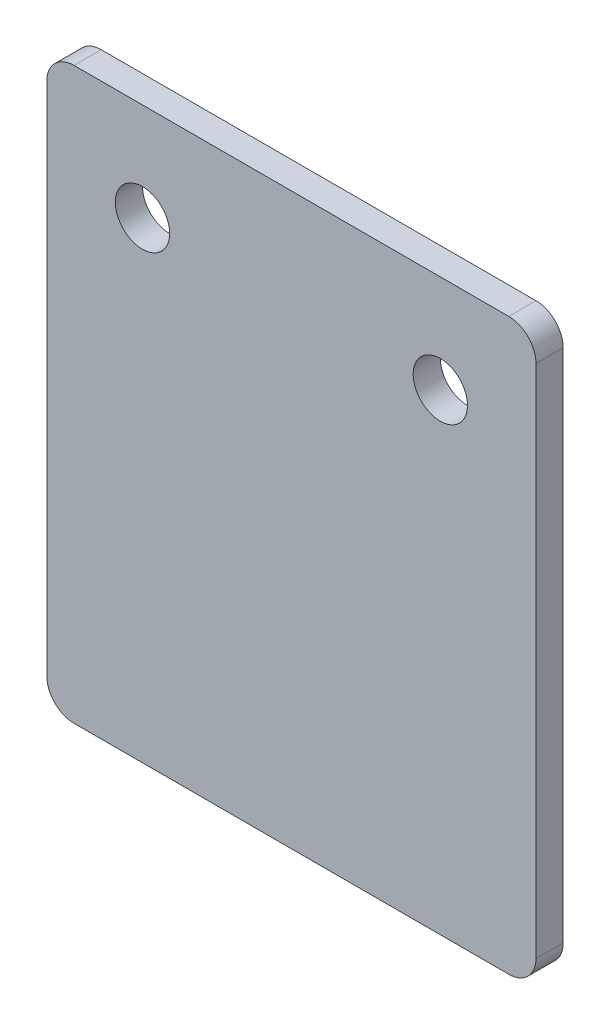
ISO-10303-21;
HEADER;
FILE_DESCRIPTION(('STEP AP214'),'2;1');
FILE_NAME('part.step','',(''),(''),'','','');
FILE_SCHEMA(('AUTOMOTIVE_DESIGN { 1 0 10303 214 1 1 1 1 }'));
ENDSEC;
DATA;
#1=APPLICATION_CONTEXT('core data for automotive mechanical design processes');
#2=APPLICATION_PROTOCOL_DEFINITION('international standard','automotive_design',2000,#1);
#3=PRODUCT_CONTEXT('',#1,'mechanical');
#4=PRODUCT('Part','Part','',(#3));
#5=PRODUCT_RELATED_PRODUCT_CATEGORY('part','',(#4));
#6=PRODUCT_DEFINITION_FORMATION('','',#4);
#7=PRODUCT_DEFINITION_CONTEXT('part definition',#1,'design');
#8=PRODUCT_DEFINITION('design','',#6,#7);
#9=PRODUCT_DEFINITION_SHAPE('','',#8);
#10=(LENGTH_UNIT() NAMED_UNIT(*) SI_UNIT(.MILLI.,.METRE.));
#11=(NAMED_UNIT(*) PLANE_ANGLE_UNIT() SI_UNIT($,.RADIAN.));
#12=(NAMED_UNIT(*) SI_UNIT($,.STERADIAN.) SOLID_ANGLE_UNIT());
#13=UNCERTAINTY_MEASURE_WITH_UNIT(LENGTH_MEASURE(1.E-05),#10,'distance_accuracy_value','');
#14=(GEOMETRIC_REPRESENTATION_CONTEXT(3) GLOBAL_UNCERTAINTY_ASSIGNED_CONTEXT((#13)) GLOBAL_UNIT_ASSIGNED_CONTEXT((#10,
#11,#12)) REPRESENTATION_CONTEXT('',''));
#15=CARTESIAN_POINT('',(0.,0.,0.));
#16=DIRECTION('',(0.,0.,1.));
#17=DIRECTION('',(1.,0.,0.));
#18=AXIS2_PLACEMENT_3D('',#15,#16,#17);
#19=CARTESIAN_POINT('',(-28.3289512231324,3.07077373787596,-3.175));
#20=DIRECTION('',(-1.,0.,0.));
#21=DIRECTION('',(0.,-1.,0.));
#22=AXIS2_PLACEMENT_3D('',#19,#20,#21);
#23=PLANE('',#22);
#24=DIRECTION('',(0.,-1.,0.));
#25=VECTOR('',#24,1.);
#26=CARTESIAN_POINT('',(-28.3289512231324,3.07077373787596,0.));
#27=LINE('',#26,#25);
#28=CARTESIAN_POINT('',(-28.3289512231324,3.07077373787596,0.));
#29=VERTEX_POINT('',#28);
#30=CARTESIAN_POINT('',(-28.3289512231324,-57.1474567040588,0.));
#31=VERTEX_POINT('',#30);
#32=EDGE_CURVE('E169',#29,#31,#27,.T.);
#33=ORIENTED_EDGE('',*,*,#32,.F.);
#34=DIRECTION('',(0.,0.,1.));
#35=VECTOR('',#34,1.);
#36=CARTESIAN_POINT('',(-28.3289512231324,3.07077373787596,-3.175));
#37=LINE('',#36,#35);
#38=CARTESIAN_POINT('',(-28.3289512231324,3.07077373787596,-3.175));
#39=VERTEX_POINT('',#38);
#40=EDGE_CURVE('E11',#39,#29,#37,.T.);
#41=ORIENTED_EDGE('',*,*,#40,.F.);
#42=DIRECTION('',(0.,-1.,0.));
#43=VECTOR('',#42,1.);
#44=CARTESIAN_POINT('',(-28.3289512231324,-34.9224567040588,-3.175));
#45=LINE('',#44,#43);
#46=CARTESIAN_POINT('',(-28.3289512231324,-57.1474567040588,-3.175));
#47=VERTEX_POINT('',#46);
#48=EDGE_CURVE('E59',#39,#47,#45,.T.);
#49=ORIENTED_EDGE('',*,*,#48,.T.);
#50=DIRECTION('',(0.,0.,1.));
#51=VECTOR('',#50,1.);
#52=CARTESIAN_POINT('',(-28.3289512231324,-57.1474567040588,-3.175));
#53=LINE('',#52,#51);
#54=EDGE_CURVE('E43',#47,#31,#53,.T.);
#55=ORIENTED_EDGE('',*,*,#54,.T.);
#56=EDGE_LOOP('',(#33,#41,#49,#55));
#57=FACE_BOUND('',#56,.T.);
#58=ADVANCED_FACE('F39',(#57),#23,.T.);
#59=CARTESIAN_POINT('',(-25.1539512231324,3.07077373787597,-3.175));
#60=DIRECTION('',(0.,0.,1.));
#61=DIRECTION('',(1.,0.,0.));
#62=AXIS2_PLACEMENT_3D('',#59,#60,#61);
#63=CYLINDRICAL_SURFACE('',#62,3.175);
#64=CARTESIAN_POINT('',(-25.1539512231324,3.07077373787597,0.));
#65=DIRECTION('',(0.,0.,1.));
#66=DIRECTION('',(1.,0.,0.));
#67=AXIS2_PLACEMENT_3D('',#64,#65,#66);
#68=CIRCLE('',#67,3.175);
#69=CARTESIAN_POINT('',(-25.1539512231324,6.24577373787597,0.));
#70=VERTEX_POINT('',#69);
#71=EDGE_CURVE('E166',#70,#29,#68,.T.);
#72=ORIENTED_EDGE('',*,*,#71,.F.);
#73=DIRECTION('',(0.,0.,1.));
#74=VECTOR('',#73,1.);
#75=CARTESIAN_POINT('',(-25.1539512231324,6.24577373787597,-3.175));
#76=LINE('',#75,#74);
#77=CARTESIAN_POINT('',(-25.1539512231324,6.24577373787597,-3.175));
#78=VERTEX_POINT('',#77);
#79=EDGE_CURVE('E50',#78,#70,#76,.T.);
#80=ORIENTED_EDGE('',*,*,#79,.F.);
#81=CARTESIAN_POINT('',(-25.1539512231324,3.07077373787597,-3.175));
#82=DIRECTION('',(0.,0.,1.));
#83=DIRECTION('',(1.,0.,0.));
#84=AXIS2_PLACEMENT_3D('',#81,#82,#83);
#85=CIRCLE('',#84,3.175);
#86=EDGE_CURVE('E129',#78,#39,#85,.T.);
#87=ORIENTED_EDGE('',*,*,#86,.T.);
#88=ORIENTED_EDGE('',*,*,#40,.T.);
#89=EDGE_LOOP('',(#72,#80,#87,#88));
#90=FACE_BOUND('',#89,.T.);
#91=ADVANCED_FACE('F190',(#90),#63,.T.);
#92=CARTESIAN_POINT('',(-25.1539512231324,6.24577373787597,-3.175));
#93=DIRECTION('',(0.,1.,0.));
#94=DIRECTION('',(0.,0.,1.));
#95=AXIS2_PLACEMENT_3D('',#92,#93,#94);
#96=PLANE('',#95);
#97=DIRECTION('',(-1.,0.,0.));
#98=VECTOR('',#97,1.);
#99=CARTESIAN_POINT('',(-25.1539512231324,6.24577373787597,0.));
#100=LINE('',#99,#98);
#101=CARTESIAN_POINT('',(25.6460487768676,6.24577373787597,0.));
#102=VERTEX_POINT('',#101);
#103=EDGE_CURVE('E117',#102,#70,#100,.T.);
#104=ORIENTED_EDGE('',*,*,#103,.F.);
#105=DIRECTION('',(0.,0.,1.));
#106=VECTOR('',#105,1.);
#107=CARTESIAN_POINT('',(25.6460487768676,6.24577373787597,-3.175));
#108=LINE('',#107,#106);
#109=CARTESIAN_POINT('',(25.6460487768676,6.24577373787597,-3.175));
#110=VERTEX_POINT('',#109);
#111=EDGE_CURVE('E112',#110,#102,#108,.T.);
#112=ORIENTED_EDGE('',*,*,#111,.F.);
#113=DIRECTION('',(-1.,0.,0.));
#114=VECTOR('',#113,1.);
#115=CARTESIAN_POINT('',(-25.1539512231324,6.24577373787597,-3.175));
#116=LINE('',#115,#114);
#117=EDGE_CURVE('E115',#110,#78,#116,.T.);
#118=ORIENTED_EDGE('',*,*,#117,.T.);
#119=ORIENTED_EDGE('',*,*,#79,.T.);
#120=EDGE_LOOP('',(#104,#112,#118,#119));
#121=FACE_BOUND('',#120,.T.);
#122=ADVANCED_FACE('F114',(#121),#96,.T.);
#123=CARTESIAN_POINT('',(25.6460487768676,3.07077373787597,-3.175));
#124=DIRECTION('',(0.,0.,1.));
#125=DIRECTION('',(1.,0.,0.));
#126=AXIS2_PLACEMENT_3D('',#123,#124,#125);
#127=CYLINDRICAL_SURFACE('',#126,3.175);
#128=CARTESIAN_POINT('',(25.6460487768676,3.07077373787597,0.));
#129=DIRECTION('',(0.,0.,1.));
#130=DIRECTION('',(-1.,0.,0.));
#131=AXIS2_PLACEMENT_3D('',#128,#129,#130);
#132=CIRCLE('',#131,3.175);
#133=CARTESIAN_POINT('',(28.8210487768676,3.07077373787597,0.));
#134=VERTEX_POINT('',#133);
#135=EDGE_CURVE('E161',#134,#102,#132,.T.);
#136=ORIENTED_EDGE('',*,*,#135,.F.);
#137=DIRECTION('',(0.,0.,1.));
#138=VECTOR('',#137,1.);
#139=CARTESIAN_POINT('',(28.8210487768676,3.07077373787597,-3.175));
#140=LINE('',#139,#138);
#141=CARTESIAN_POINT('',(28.8210487768676,3.07077373787597,-3.175));
#142=VERTEX_POINT('',#141);
#143=EDGE_CURVE('E123',#142,#134,#140,.T.);
#144=ORIENTED_EDGE('',*,*,#143,.F.);
#145=CARTESIAN_POINT('',(25.6460487768676,3.07077373787597,-3.175));
#146=DIRECTION('',(0.,0.,1.));
#147=DIRECTION('',(-1.,0.,0.));
#148=AXIS2_PLACEMENT_3D('',#145,#146,#147);
#149=CIRCLE('',#148,3.175);
#150=EDGE_CURVE('E128',#142,#110,#149,.T.);
#151=ORIENTED_EDGE('',*,*,#150,.T.);
#152=ORIENTED_EDGE('',*,*,#111,.T.);
#153=EDGE_LOOP('',(#136,#144,#151,#152));
#154=FACE_BOUND('',#153,.T.);
#155=ADVANCED_FACE('F133',(#154),#127,.T.);
#156=CARTESIAN_POINT('',(28.8210487768676,-34.9224567040588,-3.175));
#157=DIRECTION('',(1.,0.,0.));
#158=DIRECTION('',(0.,0.,-1.));
#159=AXIS2_PLACEMENT_3D('',#156,#157,#158);
#160=PLANE('',#159);
#161=DIRECTION('',(0.,1.,0.));
#162=VECTOR('',#161,1.);
#163=CARTESIAN_POINT('',(28.8210487768676,-34.9224567040588,0.));
#164=LINE('',#163,#162);
#165=CARTESIAN_POINT('',(28.8210487768676,-57.1474567040588,0.));
#166=VERTEX_POINT('',#165);
#167=EDGE_CURVE('E157',#166,#134,#164,.T.);
#168=ORIENTED_EDGE('',*,*,#167,.F.);
#169=DIRECTION('',(0.,0.,1.));
#170=VECTOR('',#169,1.);
#171=CARTESIAN_POINT('',(28.8210487768676,-57.1474567040588,-3.175));
#172=LINE('',#171,#170);
#173=CARTESIAN_POINT('',(28.8210487768676,-57.1474567040588,-3.175));
#174=VERTEX_POINT('',#173);
#175=EDGE_CURVE('E176',#174,#166,#172,.T.);
#176=ORIENTED_EDGE('',*,*,#175,.F.);
#177=DIRECTION('',(0.,1.,0.));
#178=VECTOR('',#177,1.);
#179=CARTESIAN_POINT('',(28.8210487768676,-34.9224567040588,-3.175));
#180=LINE('',#179,#178);
#181=EDGE_CURVE('E135',#174,#142,#180,.T.);
#182=ORIENTED_EDGE('',*,*,#181,.T.);
#183=ORIENTED_EDGE('',*,*,#143,.T.);
#184=EDGE_LOOP('',(#168,#176,#182,#183));
#185=FACE_BOUND('',#184,.T.);
#186=ADVANCED_FACE('F203',(#185),#160,.T.);
#187=CARTESIAN_POINT('',(25.6460487768676,-57.1474567040588,-3.175));
#188=DIRECTION('',(0.,0.,1.));
#189=DIRECTION('',(1.,0.,0.));
#190=AXIS2_PLACEMENT_3D('',#187,#188,#189);
#191=CYLINDRICAL_SURFACE('',#190,3.175);
#192=CARTESIAN_POINT('',(25.6460487768676,-57.1474567040588,0.));
#193=DIRECTION('',(0.,0.,1.));
#194=DIRECTION('',(-1.,0.,0.));
#195=AXIS2_PLACEMENT_3D('',#192,#193,#194);
#196=CIRCLE('',#195,3.175);
#197=CARTESIAN_POINT('',(25.6460487768676,-60.3224567040588,0.));
#198=VERTEX_POINT('',#197);
#199=EDGE_CURVE('E153',#198,#166,#196,.T.);
#200=ORIENTED_EDGE('',*,*,#199,.F.);
#201=DIRECTION('',(0.,0.,1.));
#202=VECTOR('',#201,1.);
#203=CARTESIAN_POINT('',(25.6460487768676,-60.3224567040588,-3.175));
#204=LINE('',#203,#202);
#205=CARTESIAN_POINT('',(25.6460487768676,-60.3224567040588,-3.175));
#206=VERTEX_POINT('',#205);
#207=EDGE_CURVE('E180',#206,#198,#204,.T.);
#208=ORIENTED_EDGE('',*,*,#207,.F.);
#209=CARTESIAN_POINT('',(25.6460487768676,-57.1474567040588,-3.175));
#210=DIRECTION('',(0.,0.,1.));
#211=DIRECTION('',(-1.,0.,0.));
#212=AXIS2_PLACEMENT_3D('',#209,#210,#211);
#213=CIRCLE('',#212,3.175);
#214=EDGE_CURVE('E138',#206,#174,#213,.T.);
#215=ORIENTED_EDGE('',*,*,#214,.T.);
#216=ORIENTED_EDGE('',*,*,#175,.T.);
#217=EDGE_LOOP('',(#200,#208,#215,#216));
#218=FACE_BOUND('',#217,.T.);
#219=ADVANCED_FACE('F206',(#218),#191,.T.);
#220=CARTESIAN_POINT('',(-25.1539512231323,-60.3224567040588,-3.175));
#221=DIRECTION('',(0.,-1.,0.));
#222=DIRECTION('',(0.,0.,-1.));
#223=AXIS2_PLACEMENT_3D('',#220,#221,#222);
#224=PLANE('',#223);
#225=DIRECTION('',(1.,0.,0.));
#226=VECTOR('',#225,1.);
#227=CARTESIAN_POINT('',(-25.1539512231323,-60.3224567040588,0.));
#228=LINE('',#227,#226);
#229=CARTESIAN_POINT('',(-25.1539512231323,-60.3224567040588,0.));
#230=VERTEX_POINT('',#229);
#231=EDGE_CURVE('E148',#230,#198,#228,.T.);
#232=ORIENTED_EDGE('',*,*,#231,.F.);
#233=DIRECTION('',(0.,0.,1.));
#234=VECTOR('',#233,1.);
#235=CARTESIAN_POINT('',(-25.1539512231323,-60.3224567040588,-3.175));
#236=LINE('',#235,#234);
#237=CARTESIAN_POINT('',(-25.1539512231323,-60.3224567040588,-3.175));
#238=VERTEX_POINT('',#237);
#239=EDGE_CURVE('E182',#238,#230,#236,.T.);
#240=ORIENTED_EDGE('',*,*,#239,.F.);
#241=DIRECTION('',(1.,0.,0.));
#242=VECTOR('',#241,1.);
#243=CARTESIAN_POINT('',(-25.1539512231323,-60.3224567040588,-3.175));
#244=LINE('',#243,#242);
#245=EDGE_CURVE('E219',#238,#206,#244,.T.);
#246=ORIENTED_EDGE('',*,*,#245,.T.);
#247=ORIENTED_EDGE('',*,*,#207,.T.);
#248=EDGE_LOOP('',(#232,#240,#246,#247));
#249=FACE_BOUND('',#248,.T.);
#250=ADVANCED_FACE('F209',(#249),#224,.T.);
#251=CARTESIAN_POINT('',(-25.1539512231324,-57.1474567040588,-3.175));
#252=DIRECTION('',(0.,0.,1.));
#253=DIRECTION('',(1.,0.,0.));
#254=AXIS2_PLACEMENT_3D('',#251,#252,#253);
#255=CYLINDRICAL_SURFACE('',#254,3.175);
#256=CARTESIAN_POINT('',(-25.1539512231324,-57.1474567040588,0.));
#257=DIRECTION('',(0.,0.,1.));
#258=DIRECTION('',(1.,0.,0.));
#259=AXIS2_PLACEMENT_3D('',#256,#257,#258);
#260=CIRCLE('',#259,3.175);
#261=EDGE_CURVE('E144',#31,#230,#260,.T.);
#262=ORIENTED_EDGE('',*,*,#261,.F.);
#263=ORIENTED_EDGE('',*,*,#54,.F.);
#264=CARTESIAN_POINT('',(-25.1539512231324,-57.1474567040588,-3.175));
#265=DIRECTION('',(0.,0.,1.));
#266=DIRECTION('',(1.,0.,0.));
#267=AXIS2_PLACEMENT_3D('',#264,#265,#266);
#268=CIRCLE('',#267,3.175);
#269=EDGE_CURVE('E224',#47,#238,#268,.T.);
#270=ORIENTED_EDGE('',*,*,#269,.T.);
#271=ORIENTED_EDGE('',*,*,#239,.T.);
#272=EDGE_LOOP('',(#262,#263,#270,#271));
#273=FACE_BOUND('',#272,.T.);
#274=ADVANCED_FACE('F41',(#273),#255,.T.);
#275=CARTESIAN_POINT('',(-25.1539512231324,-57.1474567040588,-3.175));
#276=DIRECTION('',(0.,0.,1.));
#277=DIRECTION('',(1.,0.,0.));
#278=AXIS2_PLACEMENT_3D('',#275,#276,#277);
#279=PLANE('',#278);
#280=CARTESIAN_POINT('',(-17.1529512231324,-5.18422626212403,-3.175));
#281=DIRECTION('',(0.,0.,1.));
#282=DIRECTION('',(1.,0.,0.));
#283=AXIS2_PLACEMENT_3D('',#280,#281,#282);
#284=CIRCLE('',#283,3.175);
#285=CARTESIAN_POINT('',(-13.9779512231324,-5.18422626212403,-3.175));
#286=VERTEX_POINT('',#285);
#287=EDGE_CURVE('E149',#286,#286,#284,.T.);
#288=ORIENTED_EDGE('',*,*,#287,.T.);
#289=EDGE_LOOP('',(#288));
#290=FACE_BOUND('',#289,.T.);
#291=CARTESIAN_POINT('',(17.6450487768676,-5.18422626212403,-3.175));
#292=DIRECTION('',(0.,0.,1.));
#293=DIRECTION('',(-1.,0.,0.));
#294=AXIS2_PLACEMENT_3D('',#291,#292,#293);
#295=CIRCLE('',#294,3.175);
#296=CARTESIAN_POINT('',(14.4700487768676,-5.18422626212403,-3.175));
#297=VERTEX_POINT('',#296);
#298=EDGE_CURVE('E235',#297,#297,#295,.T.);
#299=ORIENTED_EDGE('',*,*,#298,.T.);
#300=EDGE_LOOP('',(#299));
#301=FACE_BOUND('',#300,.T.);
#302=ORIENTED_EDGE('',*,*,#48,.F.);
#303=ORIENTED_EDGE('',*,*,#86,.F.);
#304=ORIENTED_EDGE('',*,*,#117,.F.);
#305=ORIENTED_EDGE('',*,*,#150,.F.);
#306=ORIENTED_EDGE('',*,*,#181,.F.);
#307=ORIENTED_EDGE('',*,*,#214,.F.);
#308=ORIENTED_EDGE('',*,*,#245,.F.);
#309=ORIENTED_EDGE('',*,*,#269,.F.);
#310=EDGE_LOOP('',(#302,#303,#304,#305,#306,#307,#308,#309));
#311=FACE_BOUND('',#310,.T.);
#312=ADVANCED_FACE('F126',(#290,#301,#311),#279,.F.);
#313=CARTESIAN_POINT('',(-25.1539512231324,-57.1474567040588,0.));
#314=DIRECTION('',(0.,0.,1.));
#315=DIRECTION('',(1.,0.,0.));
#316=AXIS2_PLACEMENT_3D('',#313,#314,#315);
#317=PLANE('',#316);
#318=CARTESIAN_POINT('',(-17.1529512231324,-5.18422626212403,0.));
#319=DIRECTION('',(0.,0.,1.));
#320=DIRECTION('',(1.,0.,0.));
#321=AXIS2_PLACEMENT_3D('',#318,#319,#320);
#322=CIRCLE('',#321,3.175);
#323=CARTESIAN_POINT('',(-13.9779512231324,-5.18422626212403,0.));
#324=VERTEX_POINT('',#323);
#325=EDGE_CURVE('E239',#324,#324,#322,.T.);
#326=ORIENTED_EDGE('',*,*,#325,.F.);
#327=EDGE_LOOP('',(#326));
#328=FACE_BOUND('',#327,.T.);
#329=CARTESIAN_POINT('',(17.6450487768676,-5.18422626212403,0.));
#330=DIRECTION('',(0.,0.,1.));
#331=DIRECTION('',(-1.,0.,0.));
#332=AXIS2_PLACEMENT_3D('',#329,#330,#331);
#333=CIRCLE('',#332,3.175);
#334=CARTESIAN_POINT('',(14.4700487768676,-5.18422626212403,0.));
#335=VERTEX_POINT('',#334);
#336=EDGE_CURVE('E231',#335,#335,#333,.T.);
#337=ORIENTED_EDGE('',*,*,#336,.F.);
#338=EDGE_LOOP('',(#337));
#339=FACE_BOUND('',#338,.T.);
#340=ORIENTED_EDGE('',*,*,#32,.T.);
#341=ORIENTED_EDGE('',*,*,#261,.T.);
#342=ORIENTED_EDGE('',*,*,#231,.T.);
#343=ORIENTED_EDGE('',*,*,#199,.T.);
#344=ORIENTED_EDGE('',*,*,#167,.T.);
#345=ORIENTED_EDGE('',*,*,#135,.T.);
#346=ORIENTED_EDGE('',*,*,#103,.T.);
#347=ORIENTED_EDGE('',*,*,#71,.T.);
#348=EDGE_LOOP('',(#340,#341,#342,#343,#344,#345,#346,#347));
#349=FACE_BOUND('',#348,.T.);
#350=ADVANCED_FACE('F189',(#328,#339,#349),#317,.T.);
#351=CARTESIAN_POINT('',(17.6450487768676,-5.18422626212403,-3.175));
#352=DIRECTION('',(0.,0.,1.));
#353=DIRECTION('',(1.,0.,0.));
#354=AXIS2_PLACEMENT_3D('',#351,#352,#353);
#355=CYLINDRICAL_SURFACE('',#354,3.175);
#356=ORIENTED_EDGE('',*,*,#298,.F.);
#357=EDGE_LOOP('',(#356));
#358=FACE_BOUND('',#357,.T.);
#359=ORIENTED_EDGE('',*,*,#336,.T.);
#360=EDGE_LOOP('',(#359));
#361=FACE_BOUND('',#360,.T.);
#362=ADVANCED_FACE('F252',(#358,#361),#355,.F.);
#363=CARTESIAN_POINT('',(-17.1529512231324,-5.18422626212403,-3.175));
#364=DIRECTION('',(0.,0.,1.));
#365=DIRECTION('',(1.,0.,0.));
#366=AXIS2_PLACEMENT_3D('',#363,#364,#365);
#367=CYLINDRICAL_SURFACE('',#366,3.175);
#368=ORIENTED_EDGE('',*,*,#287,.F.);
#369=EDGE_LOOP('',(#368));
#370=FACE_BOUND('',#369,.T.);
#371=ORIENTED_EDGE('',*,*,#325,.T.);
#372=EDGE_LOOP('',(#371));
#373=FACE_BOUND('',#372,.T.);
#374=ADVANCED_FACE('F249',(#370,#373),#367,.F.);
#375=CLOSED_SHELL('',(#58,#91,#122,#155,#186,#219,#250,#274,#312,#350,#362,#374));
#376=MANIFOLD_SOLID_BREP('B2',#375);
#377=ADVANCED_BREP_SHAPE_REPRESENTATION('',(#18,#376),#14);
#378=SHAPE_DEFINITION_REPRESENTATION(#9,#377);
ENDSEC;
END-ISO-10303-21;
